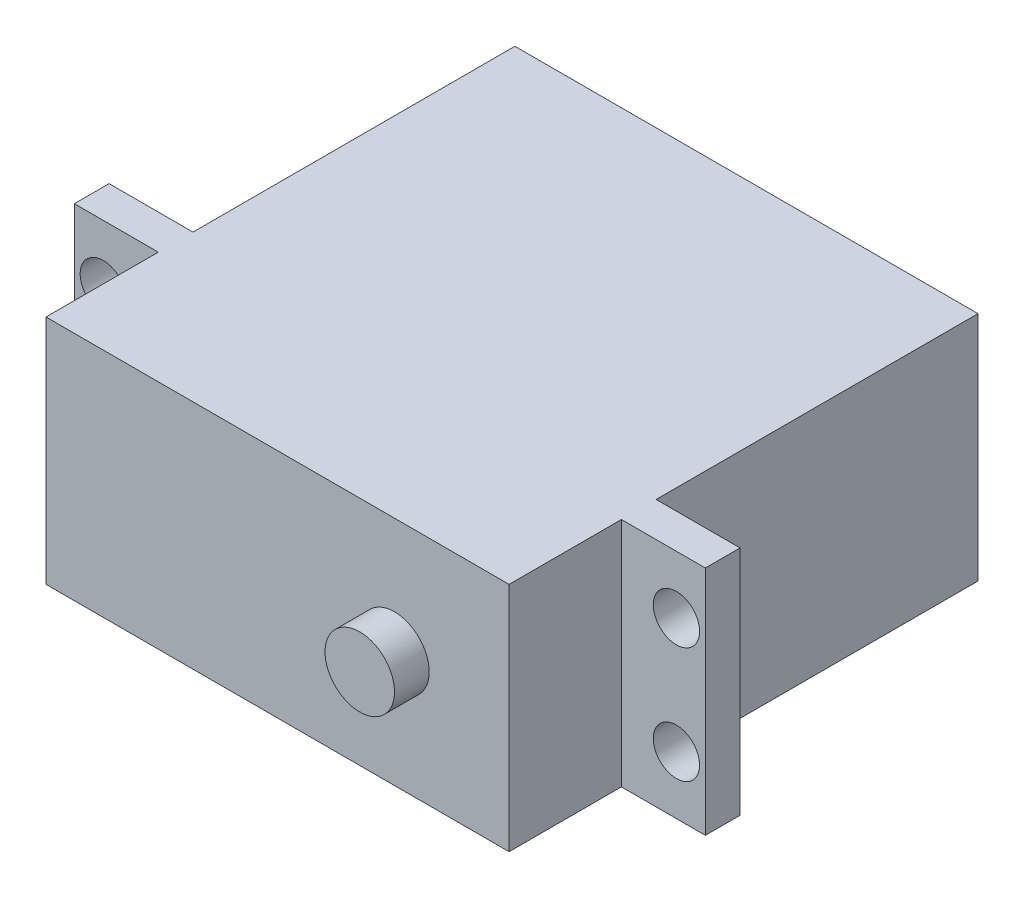
ISO-10303-21;
HEADER;
FILE_DESCRIPTION(('STEP AP214'),'2;1');
FILE_NAME('part.step','',(''),(''),'','','');
FILE_SCHEMA(('AUTOMOTIVE_DESIGN { 1 0 10303 214 1 1 1 1 }'));
ENDSEC;
DATA;
#1=APPLICATION_CONTEXT('core data for automotive mechanical design processes');
#2=APPLICATION_PROTOCOL_DEFINITION('international standard','automotive_design',2000,#1);
#3=PRODUCT_CONTEXT('',#1,'mechanical');
#4=PRODUCT('Part','Part','',(#3));
#5=PRODUCT_RELATED_PRODUCT_CATEGORY('part','',(#4));
#6=PRODUCT_DEFINITION_FORMATION('','',#4);
#7=PRODUCT_DEFINITION_CONTEXT('part definition',#1,'design');
#8=PRODUCT_DEFINITION('design','',#6,#7);
#9=PRODUCT_DEFINITION_SHAPE('','',#8);
#10=(LENGTH_UNIT() NAMED_UNIT(*) SI_UNIT(.MILLI.,.METRE.));
#11=(NAMED_UNIT(*) PLANE_ANGLE_UNIT() SI_UNIT($,.RADIAN.));
#12=(NAMED_UNIT(*) SI_UNIT($,.STERADIAN.) SOLID_ANGLE_UNIT());
#13=UNCERTAINTY_MEASURE_WITH_UNIT(LENGTH_MEASURE(1.E-05),#10,'distance_accuracy_value','');
#14=(GEOMETRIC_REPRESENTATION_CONTEXT(3) GLOBAL_UNCERTAINTY_ASSIGNED_CONTEXT((#13)) GLOBAL_UNIT_ASSIGNED_CONTEXT((#10,
#11,#12)) REPRESENTATION_CONTEXT('',''));
#15=CARTESIAN_POINT('',(0.,0.,0.));
#16=DIRECTION('',(0.,0.,1.));
#17=DIRECTION('',(1.,0.,0.));
#18=AXIS2_PLACEMENT_3D('',#15,#16,#17);
#19=CARTESIAN_POINT('',(-20.,10.,40.5));
#20=DIRECTION('',(1.,0.,0.));
#21=DIRECTION('',(0.,0.,-1.));
#22=AXIS2_PLACEMENT_3D('',#19,#20,#21);
#23=PLANE('',#22);
#24=DIRECTION('',(0.,-1.,0.));
#25=VECTOR('',#24,1.);
#26=CARTESIAN_POINT('',(-20.,9.99999999999999,27.8));
#27=LINE('',#26,#25);
#28=CARTESIAN_POINT('',(-20.,9.99999999999999,27.8));
#29=VERTEX_POINT('',#28);
#30=CARTESIAN_POINT('',(-20.,-9.99999999999999,27.8));
#31=VERTEX_POINT('',#30);
#32=EDGE_CURVE('E172',#29,#31,#27,.T.);
#33=ORIENTED_EDGE('',*,*,#32,.F.);
#34=DIRECTION('',(0.,0.,-1.));
#35=VECTOR('',#34,1.);
#36=CARTESIAN_POINT('',(-20.,10.,40.5));
#37=LINE('',#36,#35);
#38=CARTESIAN_POINT('',(-20.,10.,0.));
#39=VERTEX_POINT('',#38);
#40=EDGE_CURVE('E152',#29,#39,#37,.T.);
#41=ORIENTED_EDGE('',*,*,#40,.T.);
#42=DIRECTION('',(0.,-1.,0.));
#43=VECTOR('',#42,1.);
#44=CARTESIAN_POINT('',(-20.,10.,0.));
#45=LINE('',#44,#43);
#46=CARTESIAN_POINT('',(-20.,-10.,0.));
#47=VERTEX_POINT('',#46);
#48=EDGE_CURVE('E229',#39,#47,#45,.T.);
#49=ORIENTED_EDGE('',*,*,#48,.T.);
#50=DIRECTION('',(0.,0.,-1.));
#51=VECTOR('',#50,1.);
#52=CARTESIAN_POINT('',(-20.,-10.,40.5));
#53=LINE('',#52,#51);
#54=EDGE_CURVE('E235',#31,#47,#53,.T.);
#55=ORIENTED_EDGE('',*,*,#54,.F.);
#56=EDGE_LOOP('',(#33,#41,#49,#55));
#57=FACE_BOUND('',#56,.T.);
#58=ADVANCED_FACE('F39',(#57),#23,.F.);
#59=CARTESIAN_POINT('',(20.,10.,40.5));
#60=DIRECTION('',(-1.,0.,0.));
#61=DIRECTION('',(0.,0.,1.));
#62=AXIS2_PLACEMENT_3D('',#59,#60,#61);
#63=PLANE('',#62);
#64=DIRECTION('',(0.,1.,0.));
#65=VECTOR('',#64,1.);
#66=CARTESIAN_POINT('',(20.,10.,27.8));
#67=LINE('',#66,#65);
#68=CARTESIAN_POINT('',(20.,-10.,27.8));
#69=VERTEX_POINT('',#68);
#70=CARTESIAN_POINT('',(20.,10.,27.8));
#71=VERTEX_POINT('',#70);
#72=EDGE_CURVE('E188',#69,#71,#67,.T.);
#73=ORIENTED_EDGE('',*,*,#72,.F.);
#74=DIRECTION('',(0.,0.,-1.));
#75=VECTOR('',#74,1.);
#76=CARTESIAN_POINT('',(20.,-10.,40.5));
#77=LINE('',#76,#75);
#78=CARTESIAN_POINT('',(20.,-10.,0.));
#79=VERTEX_POINT('',#78);
#80=EDGE_CURVE('E224',#69,#79,#77,.T.);
#81=ORIENTED_EDGE('',*,*,#80,.T.);
#82=DIRECTION('',(0.,1.,0.));
#83=VECTOR('',#82,1.);
#84=CARTESIAN_POINT('',(20.,10.,0.));
#85=LINE('',#84,#83);
#86=CARTESIAN_POINT('',(20.,10.,0.));
#87=VERTEX_POINT('',#86);
#88=EDGE_CURVE('E213',#79,#87,#85,.T.);
#89=ORIENTED_EDGE('',*,*,#88,.T.);
#90=DIRECTION('',(0.,0.,-1.));
#91=VECTOR('',#90,1.);
#92=CARTESIAN_POINT('',(20.,10.,40.5));
#93=LINE('',#92,#91);
#94=EDGE_CURVE('E48',#71,#87,#93,.T.);
#95=ORIENTED_EDGE('',*,*,#94,.F.);
#96=EDGE_LOOP('',(#73,#81,#89,#95));
#97=FACE_BOUND('',#96,.T.);
#98=ADVANCED_FACE('F242',(#97),#63,.F.);
#99=CARTESIAN_POINT('',(20.,-10.,40.5));
#100=VERTEX_POINT('',#99);
#101=CARTESIAN_POINT('',(20.,-10.,30.8));
#102=VERTEX_POINT('',#101);
#103=EDGE_CURVE('E233',#100,#102,#77,.T.);
#104=ORIENTED_EDGE('',*,*,#103,.T.);
#105=DIRECTION('',(0.,1.,0.));
#106=VECTOR('',#105,1.);
#107=CARTESIAN_POINT('',(20.,10.,30.8));
#108=LINE('',#107,#106);
#109=CARTESIAN_POINT('',(20.,10.,30.8));
#110=VERTEX_POINT('',#109);
#111=EDGE_CURVE('E191',#102,#110,#108,.T.);
#112=ORIENTED_EDGE('',*,*,#111,.T.);
#113=CARTESIAN_POINT('',(20.,10.,40.5));
#114=VERTEX_POINT('',#113);
#115=EDGE_CURVE('E11',#114,#110,#93,.T.);
#116=ORIENTED_EDGE('',*,*,#115,.F.);
#117=DIRECTION('',(0.,1.,0.));
#118=VECTOR('',#117,1.);
#119=CARTESIAN_POINT('',(20.,10.,40.5));
#120=LINE('',#119,#118);
#121=EDGE_CURVE('E215',#100,#114,#120,.T.);
#122=ORIENTED_EDGE('',*,*,#121,.F.);
#123=EDGE_LOOP('',(#104,#112,#116,#122));
#124=FACE_BOUND('',#123,.T.);
#125=ADVANCED_FACE('F41',(#124),#63,.F.);
#126=CARTESIAN_POINT('',(-20.,10.,40.5));
#127=DIRECTION('',(0.,-1.,0.));
#128=DIRECTION('',(0.,0.,-1.));
#129=AXIS2_PLACEMENT_3D('',#126,#127,#128);
#130=PLANE('',#129);
#131=DIRECTION('',(-1.,0.,0.));
#132=VECTOR('',#131,1.);
#133=CARTESIAN_POINT('',(-20.,10.,0.));
#134=LINE('',#133,#132);
#135=EDGE_CURVE('E227',#87,#39,#134,.T.);
#136=ORIENTED_EDGE('',*,*,#135,.T.);
#137=ORIENTED_EDGE('',*,*,#40,.F.);
#138=DIRECTION('',(1.,0.,0.));
#139=VECTOR('',#138,1.);
#140=CARTESIAN_POINT('',(-20.,9.99999999999999,27.8));
#141=LINE('',#140,#139);
#142=CARTESIAN_POINT('',(-27.25,9.99999999999999,27.8));
#143=VERTEX_POINT('',#142);
#144=EDGE_CURVE('E169',#143,#29,#141,.T.);
#145=ORIENTED_EDGE('',*,*,#144,.F.);
#146=DIRECTION('',(0.,0.,-1.));
#147=VECTOR('',#146,1.);
#148=CARTESIAN_POINT('',(-27.25,9.99999999999999,30.8));
#149=LINE('',#148,#147);
#150=CARTESIAN_POINT('',(-27.25,9.99999999999999,30.8));
#151=VERTEX_POINT('',#150);
#152=EDGE_CURVE('E147',#151,#143,#149,.T.);
#153=ORIENTED_EDGE('',*,*,#152,.F.);
#154=DIRECTION('',(1.,0.,0.));
#155=VECTOR('',#154,1.);
#156=CARTESIAN_POINT('',(-20.,9.99999999999999,30.8));
#157=LINE('',#156,#155);
#158=CARTESIAN_POINT('',(-20.,9.99999999999999,30.8));
#159=VERTEX_POINT('',#158);
#160=EDGE_CURVE('E133',#151,#159,#157,.T.);
#161=ORIENTED_EDGE('',*,*,#160,.T.);
#162=CARTESIAN_POINT('',(-20.,10.,40.5));
#163=VERTEX_POINT('',#162);
#164=EDGE_CURVE('E144',#163,#159,#37,.T.);
#165=ORIENTED_EDGE('',*,*,#164,.F.);
#166=DIRECTION('',(-1.,0.,0.));
#167=VECTOR('',#166,1.);
#168=CARTESIAN_POINT('',(-20.,10.,40.5));
#169=LINE('',#168,#167);
#170=EDGE_CURVE('E218',#114,#163,#169,.T.);
#171=ORIENTED_EDGE('',*,*,#170,.F.);
#172=ORIENTED_EDGE('',*,*,#115,.T.);
#173=DIRECTION('',(1.,0.,0.));
#174=VECTOR('',#173,1.);
#175=CARTESIAN_POINT('',(20.,10.,30.8));
#176=LINE('',#175,#174);
#177=CARTESIAN_POINT('',(27.25,10.,30.8));
#178=VERTEX_POINT('',#177);
#179=EDGE_CURVE('E64',#110,#178,#176,.T.);
#180=ORIENTED_EDGE('',*,*,#179,.T.);
#181=DIRECTION('',(0.,0.,-1.));
#182=VECTOR('',#181,1.);
#183=CARTESIAN_POINT('',(27.25,10.,30.8));
#184=LINE('',#183,#182);
#185=CARTESIAN_POINT('',(27.25,10.,27.8));
#186=VERTEX_POINT('',#185);
#187=EDGE_CURVE('E201',#178,#186,#184,.T.);
#188=ORIENTED_EDGE('',*,*,#187,.T.);
#189=DIRECTION('',(1.,0.,0.));
#190=VECTOR('',#189,1.);
#191=CARTESIAN_POINT('',(20.,10.,27.8));
#192=LINE('',#191,#190);
#193=EDGE_CURVE('E204',#71,#186,#192,.T.);
#194=ORIENTED_EDGE('',*,*,#193,.F.);
#195=ORIENTED_EDGE('',*,*,#94,.T.);
#196=EDGE_LOOP('',(#136,#137,#145,#153,#161,#165,#171,#172,#180,#188,#194,#195));
#197=FACE_BOUND('',#196,.T.);
#198=ADVANCED_FACE('F143',(#197),#130,.F.);
#199=ORIENTED_EDGE('',*,*,#164,.T.);
#200=DIRECTION('',(0.,-1.,0.));
#201=VECTOR('',#200,1.);
#202=CARTESIAN_POINT('',(-20.,9.99999999999999,30.8));
#203=LINE('',#202,#201);
#204=CARTESIAN_POINT('',(-20.,-10.,30.8));
#205=VERTEX_POINT('',#204);
#206=EDGE_CURVE('E130',#159,#205,#203,.T.);
#207=ORIENTED_EDGE('',*,*,#206,.T.);
#208=CARTESIAN_POINT('',(-20.,-10.,40.5));
#209=VERTEX_POINT('',#208);
#210=EDGE_CURVE('E154',#209,#205,#53,.T.);
#211=ORIENTED_EDGE('',*,*,#210,.F.);
#212=DIRECTION('',(0.,-1.,0.));
#213=VECTOR('',#212,1.);
#214=CARTESIAN_POINT('',(-20.,10.,40.5));
#215=LINE('',#214,#213);
#216=EDGE_CURVE('E151',#163,#209,#215,.T.);
#217=ORIENTED_EDGE('',*,*,#216,.F.);
#218=EDGE_LOOP('',(#199,#207,#211,#217));
#219=FACE_BOUND('',#218,.T.);
#220=ADVANCED_FACE('F150',(#219),#23,.F.);
#221=CARTESIAN_POINT('',(-20.,-10.,40.5));
#222=DIRECTION('',(0.,1.,0.));
#223=DIRECTION('',(0.,0.,1.));
#224=AXIS2_PLACEMENT_3D('',#221,#222,#223);
#225=PLANE('',#224);
#226=DIRECTION('',(1.,0.,0.));
#227=VECTOR('',#226,1.);
#228=CARTESIAN_POINT('',(-20.,-10.,0.));
#229=LINE('',#228,#227);
#230=EDGE_CURVE('E219',#47,#79,#229,.T.);
#231=ORIENTED_EDGE('',*,*,#230,.T.);
#232=ORIENTED_EDGE('',*,*,#80,.F.);
#233=DIRECTION('',(-1.,0.,0.));
#234=VECTOR('',#233,1.);
#235=CARTESIAN_POINT('',(27.25,-10.,27.8));
#236=LINE('',#235,#234);
#237=CARTESIAN_POINT('',(27.25,-10.,27.8));
#238=VERTEX_POINT('',#237);
#239=EDGE_CURVE('E193',#238,#69,#236,.T.);
#240=ORIENTED_EDGE('',*,*,#239,.F.);
#241=DIRECTION('',(0.,0.,-1.));
#242=VECTOR('',#241,1.);
#243=CARTESIAN_POINT('',(27.25,-10.,30.8));
#244=LINE('',#243,#242);
#245=CARTESIAN_POINT('',(27.25,-10.,30.8));
#246=VERTEX_POINT('',#245);
#247=EDGE_CURVE('E211',#246,#238,#244,.T.);
#248=ORIENTED_EDGE('',*,*,#247,.F.);
#249=DIRECTION('',(-1.,0.,0.));
#250=VECTOR('',#249,1.);
#251=CARTESIAN_POINT('',(27.25,-10.,30.8));
#252=LINE('',#251,#250);
#253=EDGE_CURVE('E198',#246,#102,#252,.T.);
#254=ORIENTED_EDGE('',*,*,#253,.T.);
#255=ORIENTED_EDGE('',*,*,#103,.F.);
#256=DIRECTION('',(1.,0.,0.));
#257=VECTOR('',#256,1.);
#258=CARTESIAN_POINT('',(-20.,-10.,40.5));
#259=LINE('',#258,#257);
#260=EDGE_CURVE('E222',#209,#100,#259,.T.);
#261=ORIENTED_EDGE('',*,*,#260,.F.);
#262=ORIENTED_EDGE('',*,*,#210,.T.);
#263=DIRECTION('',(-1.,0.,0.));
#264=VECTOR('',#263,1.);
#265=CARTESIAN_POINT('',(-27.25,-9.99999999999999,30.8));
#266=LINE('',#265,#264);
#267=CARTESIAN_POINT('',(-27.25,-9.99999999999999,30.8));
#268=VERTEX_POINT('',#267);
#269=EDGE_CURVE('E56',#205,#268,#266,.T.);
#270=ORIENTED_EDGE('',*,*,#269,.T.);
#271=DIRECTION('',(0.,0.,-1.));
#272=VECTOR('',#271,1.);
#273=CARTESIAN_POINT('',(-27.25,-9.99999999999999,30.8));
#274=LINE('',#273,#272);
#275=CARTESIAN_POINT('',(-27.25,-9.99999999999999,27.8));
#276=VERTEX_POINT('',#275);
#277=EDGE_CURVE('E189',#268,#276,#274,.T.);
#278=ORIENTED_EDGE('',*,*,#277,.T.);
#279=DIRECTION('',(-1.,0.,0.));
#280=VECTOR('',#279,1.);
#281=CARTESIAN_POINT('',(-27.25,-9.99999999999999,27.8));
#282=LINE('',#281,#280);
#283=EDGE_CURVE('E178',#31,#276,#282,.T.);
#284=ORIENTED_EDGE('',*,*,#283,.F.);
#285=ORIENTED_EDGE('',*,*,#54,.T.);
#286=EDGE_LOOP('',(#231,#232,#240,#248,#254,#255,#261,#262,#270,#278,#284,#285));
#287=FACE_BOUND('',#286,.T.);
#288=ADVANCED_FACE('F248',(#287),#225,.F.);
#289=CARTESIAN_POINT('',(0.,0.,40.5));
#290=DIRECTION('',(0.,0.,1.));
#291=DIRECTION('',(1.,0.,0.));
#292=AXIS2_PLACEMENT_3D('',#289,#290,#291);
#293=PLANE('',#292);
#294=CARTESIAN_POINT('',(10.1,0.,40.5));
#295=DIRECTION('',(0.,0.,1.));
#296=DIRECTION('',(1.,0.,0.));
#297=AXIS2_PLACEMENT_3D('',#294,#295,#296);
#298=CIRCLE('',#297,3.);
#299=CARTESIAN_POINT('',(13.1,0.,40.5));
#300=VERTEX_POINT('',#299);
#301=EDGE_CURVE('E456',#300,#300,#298,.T.);
#302=ORIENTED_EDGE('',*,*,#301,.F.);
#303=EDGE_LOOP('',(#302));
#304=FACE_BOUND('',#303,.T.);
#305=ORIENTED_EDGE('',*,*,#121,.T.);
#306=ORIENTED_EDGE('',*,*,#170,.T.);
#307=ORIENTED_EDGE('',*,*,#216,.T.);
#308=ORIENTED_EDGE('',*,*,#260,.T.);
#309=EDGE_LOOP('',(#305,#306,#307,#308));
#310=FACE_BOUND('',#309,.T.);
#311=ADVANCED_FACE('F264',(#304,#310),#293,.T.);
#312=CARTESIAN_POINT('',(0.,0.,0.));
#313=DIRECTION('',(0.,0.,1.));
#314=DIRECTION('',(1.,0.,0.));
#315=AXIS2_PLACEMENT_3D('',#312,#313,#314);
#316=PLANE('',#315);
#317=ORIENTED_EDGE('',*,*,#88,.F.);
#318=ORIENTED_EDGE('',*,*,#230,.F.);
#319=ORIENTED_EDGE('',*,*,#48,.F.);
#320=ORIENTED_EDGE('',*,*,#135,.F.);
#321=EDGE_LOOP('',(#317,#318,#319,#320));
#322=FACE_BOUND('',#321,.T.);
#323=ADVANCED_FACE('F253',(#322),#316,.F.);
#324=CARTESIAN_POINT('',(27.25,10.,30.8));
#325=DIRECTION('',(1.,0.,0.));
#326=DIRECTION('',(0.,0.,-1.));
#327=AXIS2_PLACEMENT_3D('',#324,#325,#326);
#328=PLANE('',#327);
#329=DIRECTION('',(0.,-1.,0.));
#330=VECTOR('',#329,1.);
#331=CARTESIAN_POINT('',(27.25,10.,27.8));
#332=LINE('',#331,#330);
#333=EDGE_CURVE('E207',#186,#238,#332,.T.);
#334=ORIENTED_EDGE('',*,*,#333,.F.);
#335=ORIENTED_EDGE('',*,*,#187,.F.);
#336=DIRECTION('',(0.,-1.,0.));
#337=VECTOR('',#336,1.);
#338=CARTESIAN_POINT('',(27.25,10.,30.8));
#339=LINE('',#338,#337);
#340=EDGE_CURVE('E195',#178,#246,#339,.T.);
#341=ORIENTED_EDGE('',*,*,#340,.T.);
#342=ORIENTED_EDGE('',*,*,#247,.T.);
#343=EDGE_LOOP('',(#334,#335,#341,#342));
#344=FACE_BOUND('',#343,.T.);
#345=ADVANCED_FACE('F260',(#344),#328,.T.);
#346=CARTESIAN_POINT('',(0.,0.,30.8));
#347=DIRECTION('',(0.,0.,-1.));
#348=DIRECTION('',(-1.,0.,0.));
#349=AXIS2_PLACEMENT_3D('',#346,#347,#348);
#350=PLANE('',#349);
#351=CARTESIAN_POINT('',(24.75,5.00000000000001,30.8));
#352=DIRECTION('',(0.,0.,1.));
#353=DIRECTION('',(-1.,0.,0.));
#354=AXIS2_PLACEMENT_3D('',#351,#352,#353);
#355=CIRCLE('',#354,2.);
#356=CARTESIAN_POINT('',(22.75,5.00000000000001,30.8));
#357=VERTEX_POINT('',#356);
#358=EDGE_CURVE('E461',#357,#357,#355,.T.);
#359=ORIENTED_EDGE('',*,*,#358,.F.);
#360=EDGE_LOOP('',(#359));
#361=FACE_BOUND('',#360,.T.);
#362=CARTESIAN_POINT('',(24.75,-4.99999999999999,30.8));
#363=DIRECTION('',(0.,0.,1.));
#364=DIRECTION('',(-1.,0.,0.));
#365=AXIS2_PLACEMENT_3D('',#362,#363,#364);
#366=CIRCLE('',#365,2.);
#367=CARTESIAN_POINT('',(22.75,-4.99999999999999,30.8));
#368=VERTEX_POINT('',#367);
#369=EDGE_CURVE('E467',#368,#368,#366,.T.);
#370=ORIENTED_EDGE('',*,*,#369,.F.);
#371=EDGE_LOOP('',(#370));
#372=FACE_BOUND('',#371,.T.);
#373=ORIENTED_EDGE('',*,*,#111,.F.);
#374=ORIENTED_EDGE('',*,*,#253,.F.);
#375=ORIENTED_EDGE('',*,*,#340,.F.);
#376=ORIENTED_EDGE('',*,*,#179,.F.);
#377=EDGE_LOOP('',(#373,#374,#375,#376));
#378=FACE_BOUND('',#377,.T.);
#379=ADVANCED_FACE('F261',(#361,#372,#378),#350,.F.);
#380=CARTESIAN_POINT('',(0.,0.,27.8));
#381=DIRECTION('',(0.,0.,-1.));
#382=DIRECTION('',(-1.,0.,0.));
#383=AXIS2_PLACEMENT_3D('',#380,#381,#382);
#384=PLANE('',#383);
#385=CARTESIAN_POINT('',(24.75,5.00000000000001,27.8));
#386=DIRECTION('',(0.,0.,-1.));
#387=DIRECTION('',(-1.,0.,0.));
#388=AXIS2_PLACEMENT_3D('',#385,#386,#387);
#389=CIRCLE('',#388,2.);
#390=CARTESIAN_POINT('',(22.75,5.00000000000001,27.8));
#391=VERTEX_POINT('',#390);
#392=EDGE_CURVE('E43',#391,#391,#389,.T.);
#393=ORIENTED_EDGE('',*,*,#392,.F.);
#394=EDGE_LOOP('',(#393));
#395=FACE_BOUND('',#394,.T.);
#396=CARTESIAN_POINT('',(24.75,-4.99999999999999,27.8));
#397=DIRECTION('',(0.,0.,-1.));
#398=DIRECTION('',(-1.,0.,0.));
#399=AXIS2_PLACEMENT_3D('',#396,#397,#398);
#400=CIRCLE('',#399,2.);
#401=CARTESIAN_POINT('',(22.75,-4.99999999999999,27.8));
#402=VERTEX_POINT('',#401);
#403=EDGE_CURVE('E164',#402,#402,#400,.T.);
#404=ORIENTED_EDGE('',*,*,#403,.F.);
#405=EDGE_LOOP('',(#404));
#406=FACE_BOUND('',#405,.T.);
#407=ORIENTED_EDGE('',*,*,#72,.T.);
#408=ORIENTED_EDGE('',*,*,#193,.T.);
#409=ORIENTED_EDGE('',*,*,#333,.T.);
#410=ORIENTED_EDGE('',*,*,#239,.T.);
#411=EDGE_LOOP('',(#407,#408,#409,#410));
#412=FACE_BOUND('',#411,.T.);
#413=ADVANCED_FACE('F257',(#395,#406,#412),#384,.T.);
#414=CARTESIAN_POINT('',(-27.25,9.99999999999999,30.8));
#415=DIRECTION('',(-1.,0.,0.));
#416=DIRECTION('',(0.,0.,1.));
#417=AXIS2_PLACEMENT_3D('',#414,#415,#416);
#418=PLANE('',#417);
#419=DIRECTION('',(0.,1.,0.));
#420=VECTOR('',#419,1.);
#421=CARTESIAN_POINT('',(-27.25,9.99999999999999,27.8));
#422=LINE('',#421,#420);
#423=EDGE_CURVE('E148',#276,#143,#422,.T.);
#424=ORIENTED_EDGE('',*,*,#423,.F.);
#425=ORIENTED_EDGE('',*,*,#277,.F.);
#426=DIRECTION('',(0.,1.,0.));
#427=VECTOR('',#426,1.);
#428=CARTESIAN_POINT('',(-27.25,9.99999999999999,30.8));
#429=LINE('',#428,#427);
#430=EDGE_CURVE('E181',#268,#151,#429,.T.);
#431=ORIENTED_EDGE('',*,*,#430,.T.);
#432=ORIENTED_EDGE('',*,*,#152,.T.);
#433=EDGE_LOOP('',(#424,#425,#431,#432));
#434=FACE_BOUND('',#433,.T.);
#435=ADVANCED_FACE('F268',(#434),#418,.T.);
#436=CARTESIAN_POINT('',(0.,0.,30.8));
#437=DIRECTION('',(0.,0.,1.));
#438=DIRECTION('',(1.,0.,0.));
#439=AXIS2_PLACEMENT_3D('',#436,#437,#438);
#440=PLANE('',#439);
#441=CARTESIAN_POINT('',(-24.75,-5.,30.8));
#442=DIRECTION('',(0.,0.,1.));
#443=DIRECTION('',(1.,0.,0.));
#444=AXIS2_PLACEMENT_3D('',#441,#442,#443);
#445=CIRCLE('',#444,2.);
#446=CARTESIAN_POINT('',(-22.75,-5.,30.8));
#447=VERTEX_POINT('',#446);
#448=EDGE_CURVE('E464',#447,#447,#445,.T.);
#449=ORIENTED_EDGE('',*,*,#448,.F.);
#450=EDGE_LOOP('',(#449));
#451=FACE_BOUND('',#450,.T.);
#452=CARTESIAN_POINT('',(-24.75,5.,30.8));
#453=DIRECTION('',(0.,0.,1.));
#454=DIRECTION('',(1.,0.,0.));
#455=AXIS2_PLACEMENT_3D('',#452,#453,#454);
#456=CIRCLE('',#455,2.);
#457=CARTESIAN_POINT('',(-22.75,5.,30.8));
#458=VERTEX_POINT('',#457);
#459=EDGE_CURVE('E162',#458,#458,#456,.T.);
#460=ORIENTED_EDGE('',*,*,#459,.F.);
#461=EDGE_LOOP('',(#460));
#462=FACE_BOUND('',#461,.T.);
#463=ORIENTED_EDGE('',*,*,#160,.F.);
#464=ORIENTED_EDGE('',*,*,#430,.F.);
#465=ORIENTED_EDGE('',*,*,#269,.F.);
#466=ORIENTED_EDGE('',*,*,#206,.F.);
#467=EDGE_LOOP('',(#463,#464,#465,#466));
#468=FACE_BOUND('',#467,.T.);
#469=ADVANCED_FACE('F132',(#451,#462,#468),#440,.T.);
#470=CARTESIAN_POINT('',(0.,0.,27.8));
#471=DIRECTION('',(0.,0.,1.));
#472=DIRECTION('',(1.,0.,0.));
#473=AXIS2_PLACEMENT_3D('',#470,#471,#472);
#474=PLANE('',#473);
#475=CARTESIAN_POINT('',(-24.75,-5.,27.8));
#476=DIRECTION('',(0.,0.,1.));
#477=DIRECTION('',(1.,0.,0.));
#478=AXIS2_PLACEMENT_3D('',#475,#476,#477);
#479=CIRCLE('',#478,2.);
#480=CARTESIAN_POINT('',(-22.75,-5.,27.8));
#481=VERTEX_POINT('',#480);
#482=EDGE_CURVE('E161',#481,#481,#479,.T.);
#483=ORIENTED_EDGE('',*,*,#482,.T.);
#484=EDGE_LOOP('',(#483));
#485=FACE_BOUND('',#484,.T.);
#486=CARTESIAN_POINT('',(-24.75,5.,27.8));
#487=DIRECTION('',(0.,0.,1.));
#488=DIRECTION('',(1.,0.,0.));
#489=AXIS2_PLACEMENT_3D('',#486,#487,#488);
#490=CIRCLE('',#489,2.);
#491=CARTESIAN_POINT('',(-22.75,5.,27.8));
#492=VERTEX_POINT('',#491);
#493=EDGE_CURVE('E158',#492,#492,#490,.T.);
#494=ORIENTED_EDGE('',*,*,#493,.T.);
#495=EDGE_LOOP('',(#494));
#496=FACE_BOUND('',#495,.T.);
#497=ORIENTED_EDGE('',*,*,#144,.T.);
#498=ORIENTED_EDGE('',*,*,#32,.T.);
#499=ORIENTED_EDGE('',*,*,#283,.T.);
#500=ORIENTED_EDGE('',*,*,#423,.T.);
#501=EDGE_LOOP('',(#497,#498,#499,#500));
#502=FACE_BOUND('',#501,.T.);
#503=ADVANCED_FACE('F269',(#485,#496,#502),#474,.F.);
#504=CARTESIAN_POINT('',(-24.75,5.,25.8));
#505=DIRECTION('',(0.,0.,1.));
#506=DIRECTION('',(1.,0.,0.));
#507=AXIS2_PLACEMENT_3D('',#504,#505,#506);
#508=CYLINDRICAL_SURFACE('',#507,2.);
#509=ORIENTED_EDGE('',*,*,#459,.T.);
#510=EDGE_LOOP('',(#509));
#511=FACE_BOUND('',#510,.T.);
#512=ORIENTED_EDGE('',*,*,#493,.F.);
#513=EDGE_LOOP('',(#512));
#514=FACE_BOUND('',#513,.T.);
#515=ADVANCED_FACE('F350',(#511,#514),#508,.F.);
#516=CARTESIAN_POINT('',(-24.75,-5.,25.8));
#517=DIRECTION('',(0.,0.,1.));
#518=DIRECTION('',(1.,0.,0.));
#519=AXIS2_PLACEMENT_3D('',#516,#517,#518);
#520=CYLINDRICAL_SURFACE('',#519,2.);
#521=ORIENTED_EDGE('',*,*,#448,.T.);
#522=EDGE_LOOP('',(#521));
#523=FACE_BOUND('',#522,.T.);
#524=ORIENTED_EDGE('',*,*,#482,.F.);
#525=EDGE_LOOP('',(#524));
#526=FACE_BOUND('',#525,.T.);
#527=ADVANCED_FACE('F358',(#523,#526),#520,.F.);
#528=CARTESIAN_POINT('',(24.75,-4.99999999999999,25.8));
#529=DIRECTION('',(0.,0.,1.));
#530=DIRECTION('',(1.,0.,0.));
#531=AXIS2_PLACEMENT_3D('',#528,#529,#530);
#532=CYLINDRICAL_SURFACE('',#531,2.);
#533=ORIENTED_EDGE('',*,*,#403,.T.);
#534=EDGE_LOOP('',(#533));
#535=FACE_BOUND('',#534,.T.);
#536=ORIENTED_EDGE('',*,*,#369,.T.);
#537=EDGE_LOOP('',(#536));
#538=FACE_BOUND('',#537,.T.);
#539=ADVANCED_FACE('F366',(#535,#538),#532,.F.);
#540=CARTESIAN_POINT('',(24.75,5.00000000000001,25.8));
#541=DIRECTION('',(0.,0.,1.));
#542=DIRECTION('',(1.,0.,0.));
#543=AXIS2_PLACEMENT_3D('',#540,#541,#542);
#544=CYLINDRICAL_SURFACE('',#543,2.);
#545=ORIENTED_EDGE('',*,*,#392,.T.);
#546=EDGE_LOOP('',(#545));
#547=FACE_BOUND('',#546,.T.);
#548=ORIENTED_EDGE('',*,*,#358,.T.);
#549=EDGE_LOOP('',(#548));
#550=FACE_BOUND('',#549,.T.);
#551=ADVANCED_FACE('F374',(#547,#550),#544,.F.);
#552=CARTESIAN_POINT('',(10.1,0.,43.5));
#553=DIRECTION('',(0.,0.,-1.));
#554=DIRECTION('',(-1.,0.,0.));
#555=AXIS2_PLACEMENT_3D('',#552,#553,#554);
#556=CYLINDRICAL_SURFACE('',#555,3.);
#557=CARTESIAN_POINT('',(10.1,0.,43.5));
#558=DIRECTION('',(0.,0.,1.));
#559=DIRECTION('',(1.,0.,0.));
#560=AXIS2_PLACEMENT_3D('',#557,#558,#559);
#561=CIRCLE('',#560,3.);
#562=CARTESIAN_POINT('',(13.1,0.,43.5));
#563=VERTEX_POINT('',#562);
#564=EDGE_CURVE('E458',#563,#563,#561,.T.);
#565=ORIENTED_EDGE('',*,*,#564,.F.);
#566=EDGE_LOOP('',(#565));
#567=FACE_BOUND('',#566,.T.);
#568=ORIENTED_EDGE('',*,*,#301,.T.);
#569=EDGE_LOOP('',(#568));
#570=FACE_BOUND('',#569,.T.);
#571=ADVANCED_FACE('F381',(#567,#570),#556,.T.);
#572=CARTESIAN_POINT('',(10.1,0.,43.5));
#573=DIRECTION('',(0.,0.,1.));
#574=DIRECTION('',(1.,0.,0.));
#575=AXIS2_PLACEMENT_3D('',#572,#573,#574);
#576=PLANE('',#575);
#577=ORIENTED_EDGE('',*,*,#564,.T.);
#578=EDGE_LOOP('',(#577));
#579=FACE_BOUND('',#578,.T.);
#580=ADVANCED_FACE('F388',(#579),#576,.T.);
#581=CLOSED_SHELL('',(#58,#98,#125,#198,#220,#288,#311,#323,#345,#379,#413,#435,#469,#503,#515,
#527,#539,#551,#571,#580));
#582=MANIFOLD_SOLID_BREP('B2',#581);
#583=ADVANCED_BREP_SHAPE_REPRESENTATION('',(#18,#582),#14);
#584=SHAPE_DEFINITION_REPRESENTATION(#9,#583);
ENDSEC;
END-ISO-10303-21;
